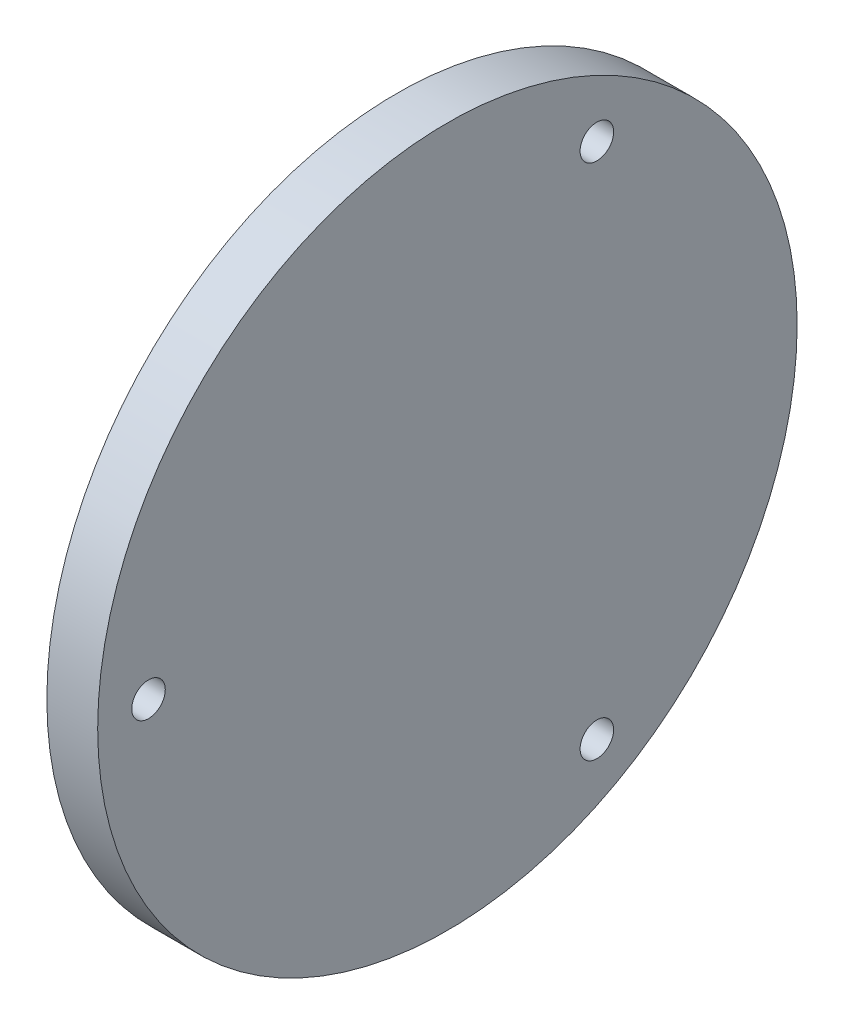
ISO-10303-21;
HEADER;
FILE_DESCRIPTION(('STEP AP214'),'2;1');
FILE_NAME('part.step','',(''),(''),'','','');
FILE_SCHEMA(('AUTOMOTIVE_DESIGN { 1 0 10303 214 1 1 1 1 }'));
ENDSEC;
DATA;
#1=APPLICATION_CONTEXT('core data for automotive mechanical design processes');
#2=APPLICATION_PROTOCOL_DEFINITION('international standard','automotive_design',2000,#1);
#3=PRODUCT_CONTEXT('',#1,'mechanical');
#4=PRODUCT('Part','Part','',(#3));
#5=PRODUCT_RELATED_PRODUCT_CATEGORY('part','',(#4));
#6=PRODUCT_DEFINITION_FORMATION('','',#4);
#7=PRODUCT_DEFINITION_CONTEXT('part definition',#1,'design');
#8=PRODUCT_DEFINITION('design','',#6,#7);
#9=PRODUCT_DEFINITION_SHAPE('','',#8);
#10=(LENGTH_UNIT() NAMED_UNIT(*) SI_UNIT(.MILLI.,.METRE.));
#11=(NAMED_UNIT(*) PLANE_ANGLE_UNIT() SI_UNIT($,.RADIAN.));
#12=(NAMED_UNIT(*) SI_UNIT($,.STERADIAN.) SOLID_ANGLE_UNIT());
#13=UNCERTAINTY_MEASURE_WITH_UNIT(LENGTH_MEASURE(1.E-05),#10,'distance_accuracy_value','');
#14=(GEOMETRIC_REPRESENTATION_CONTEXT(3) GLOBAL_UNCERTAINTY_ASSIGNED_CONTEXT((#13)) GLOBAL_UNIT_ASSIGNED_CONTEXT((#10,
#11,#12)) REPRESENTATION_CONTEXT('',''));
#15=CARTESIAN_POINT('',(0.,0.,0.));
#16=DIRECTION('',(0.,0.,1.));
#17=DIRECTION('',(1.,0.,0.));
#18=AXIS2_PLACEMENT_3D('',#15,#16,#17);
#19=CARTESIAN_POINT('',(163.7,34.4,0.));
#20=DIRECTION('',(1.,0.,0.));
#21=DIRECTION('',(0.,0.,-1.));
#22=AXIS2_PLACEMENT_3D('',#19,#20,#21);
#23=PLANE('',#22);
#24=CARTESIAN_POINT('',(163.7,0.,-29.4));
#25=DIRECTION('',(1.,0.,0.));
#26=DIRECTION('',(0.,0.,-1.));
#27=AXIS2_PLACEMENT_3D('',#24,#25,#26);
#28=CIRCLE('',#27,1.65);
#29=CARTESIAN_POINT('',(163.7,0.,-31.05));
#30=VERTEX_POINT('',#29);
#31=EDGE_CURVE('E34',#30,#30,#28,.T.);
#32=ORIENTED_EDGE('',*,*,#31,.T.);
#33=EDGE_LOOP('',(#32));
#34=FACE_BOUND('',#33,.T.);
#35=CARTESIAN_POINT('',(163.7,25.4611468712625,14.7));
#36=DIRECTION('',(1.,0.,0.));
#37=DIRECTION('',(0.,0.,-1.));
#38=AXIS2_PLACEMENT_3D('',#35,#36,#37);
#39=CIRCLE('',#38,1.65);
#40=CARTESIAN_POINT('',(163.7,25.4611468712625,13.05));
#41=VERTEX_POINT('',#40);
#42=EDGE_CURVE('E49',#41,#41,#39,.T.);
#43=ORIENTED_EDGE('',*,*,#42,.T.);
#44=EDGE_LOOP('',(#43));
#45=FACE_BOUND('',#44,.T.);
#46=CARTESIAN_POINT('',(163.7,-25.4611468712625,14.7));
#47=DIRECTION('',(1.,0.,0.));
#48=DIRECTION('',(0.,0.,-1.));
#49=AXIS2_PLACEMENT_3D('',#46,#47,#48);
#50=CIRCLE('',#49,1.65);
#51=CARTESIAN_POINT('',(163.7,-25.4611468712625,13.05));
#52=VERTEX_POINT('',#51);
#53=EDGE_CURVE('E47',#52,#52,#50,.T.);
#54=ORIENTED_EDGE('',*,*,#53,.T.);
#55=EDGE_LOOP('',(#54));
#56=FACE_BOUND('',#55,.T.);
#57=CARTESIAN_POINT('',(163.7,0.,29.4));
#58=DIRECTION('',(1.,0.,0.));
#59=DIRECTION('',(0.,0.,-1.));
#60=AXIS2_PLACEMENT_3D('',#57,#58,#59);
#61=CIRCLE('',#60,1.65);
#62=CARTESIAN_POINT('',(163.7,0.,27.75));
#63=VERTEX_POINT('',#62);
#64=EDGE_CURVE('E43',#63,#63,#61,.F.);
#65=ORIENTED_EDGE('',*,*,#64,.F.);
#66=EDGE_LOOP('',(#65));
#67=FACE_BOUND('',#66,.T.);
#68=CARTESIAN_POINT('',(163.7,-25.4611468712625,-14.7));
#69=DIRECTION('',(1.,0.,0.));
#70=DIRECTION('',(0.,0.,-1.));
#71=AXIS2_PLACEMENT_3D('',#68,#69,#70);
#72=CIRCLE('',#71,1.65);
#73=CARTESIAN_POINT('',(163.7,-25.4611468712625,-16.35));
#74=VERTEX_POINT('',#73);
#75=EDGE_CURVE('E71',#74,#74,#72,.F.);
#76=ORIENTED_EDGE('',*,*,#75,.F.);
#77=EDGE_LOOP('',(#76));
#78=FACE_BOUND('',#77,.T.);
#79=CARTESIAN_POINT('',(163.7,25.4611468712625,-14.7));
#80=DIRECTION('',(1.,0.,0.));
#81=DIRECTION('',(0.,0.,-1.));
#82=AXIS2_PLACEMENT_3D('',#79,#80,#81);
#83=CIRCLE('',#82,1.65);
#84=CARTESIAN_POINT('',(163.7,25.4611468712625,-16.35));
#85=VERTEX_POINT('',#84);
#86=EDGE_CURVE('E68',#85,#85,#83,.F.);
#87=ORIENTED_EDGE('',*,*,#86,.F.);
#88=EDGE_LOOP('',(#87));
#89=FACE_BOUND('',#88,.T.);
#90=CARTESIAN_POINT('',(163.7,0.,0.));
#91=DIRECTION('',(-1.,0.,0.));
#92=DIRECTION('',(0.,0.,1.));
#93=AXIS2_PLACEMENT_3D('',#90,#91,#92);
#94=CIRCLE('',#93,34.4);
#95=CARTESIAN_POINT('',(163.7,0.,34.4));
#96=VERTEX_POINT('',#95);
#97=EDGE_CURVE('E38',#96,#96,#94,.T.);
#98=ORIENTED_EDGE('',*,*,#97,.T.);
#99=EDGE_LOOP('',(#98));
#100=FACE_BOUND('',#99,.T.);
#101=ADVANCED_FACE('F31',(#34,#45,#56,#67,#78,#89,#100),#23,.F.);
#102=CARTESIAN_POINT('',(168.7,0.,0.));
#103=DIRECTION('',(-1.,0.,0.));
#104=DIRECTION('',(0.,0.,1.));
#105=AXIS2_PLACEMENT_3D('',#102,#103,#104);
#106=PLANE('',#105);
#107=CARTESIAN_POINT('',(168.7,0.,29.4));
#108=DIRECTION('',(1.,0.,0.));
#109=DIRECTION('',(0.,0.,-1.));
#110=AXIS2_PLACEMENT_3D('',#107,#108,#109);
#111=CIRCLE('',#110,1.65);
#112=CARTESIAN_POINT('',(168.7,0.,27.75));
#113=VERTEX_POINT('',#112);
#114=EDGE_CURVE('E64',#113,#113,#111,.T.);
#115=ORIENTED_EDGE('',*,*,#114,.F.);
#116=EDGE_LOOP('',(#115));
#117=FACE_BOUND('',#116,.T.);
#118=CARTESIAN_POINT('',(168.7,-25.4611468712625,-14.7));
#119=DIRECTION('',(1.,0.,0.));
#120=DIRECTION('',(0.,0.,-1.));
#121=AXIS2_PLACEMENT_3D('',#118,#119,#120);
#122=CIRCLE('',#121,1.65);
#123=CARTESIAN_POINT('',(168.7,-25.4611468712625,-16.35));
#124=VERTEX_POINT('',#123);
#125=EDGE_CURVE('E59',#124,#124,#122,.T.);
#126=ORIENTED_EDGE('',*,*,#125,.F.);
#127=EDGE_LOOP('',(#126));
#128=FACE_BOUND('',#127,.T.);
#129=CARTESIAN_POINT('',(168.7,25.4611468712625,-14.7));
#130=DIRECTION('',(1.,0.,0.));
#131=DIRECTION('',(0.,0.,-1.));
#132=AXIS2_PLACEMENT_3D('',#129,#130,#131);
#133=CIRCLE('',#132,1.65);
#134=CARTESIAN_POINT('',(168.7,25.4611468712625,-16.35));
#135=VERTEX_POINT('',#134);
#136=EDGE_CURVE('E55',#135,#135,#133,.T.);
#137=ORIENTED_EDGE('',*,*,#136,.F.);
#138=EDGE_LOOP('',(#137));
#139=FACE_BOUND('',#138,.T.);
#140=CARTESIAN_POINT('',(168.7,0.,0.));
#141=DIRECTION('',(-1.,0.,0.));
#142=DIRECTION('',(0.,0.,1.));
#143=AXIS2_PLACEMENT_3D('',#140,#141,#142);
#144=CIRCLE('',#143,34.4);
#145=CARTESIAN_POINT('',(168.7,0.,34.4));
#146=VERTEX_POINT('',#145);
#147=EDGE_CURVE('E10',#146,#146,#144,.T.);
#148=ORIENTED_EDGE('',*,*,#147,.F.);
#149=EDGE_LOOP('',(#148));
#150=FACE_BOUND('',#149,.T.);
#151=ADVANCED_FACE('F80',(#117,#128,#139,#150),#106,.F.);
#152=CARTESIAN_POINT('',(-110.,0.,0.));
#153=DIRECTION('',(-1.,0.,0.));
#154=DIRECTION('',(0.,0.,1.));
#155=AXIS2_PLACEMENT_3D('',#152,#153,#154);
#156=CYLINDRICAL_SURFACE('',#155,34.4);
#157=ORIENTED_EDGE('',*,*,#97,.F.);
#158=EDGE_LOOP('',(#157));
#159=FACE_BOUND('',#158,.T.);
#160=ORIENTED_EDGE('',*,*,#147,.T.);
#161=EDGE_LOOP('',(#160));
#162=FACE_BOUND('',#161,.T.);
#163=ADVANCED_FACE('F87',(#159,#162),#156,.T.);
#164=CARTESIAN_POINT('',(163.7,25.4611468712625,-14.7));
#165=DIRECTION('',(-1.,0.,0.));
#166=DIRECTION('',(0.,0.,1.));
#167=AXIS2_PLACEMENT_3D('',#164,#165,#166);
#168=CYLINDRICAL_SURFACE('',#167,1.65);
#169=ORIENTED_EDGE('',*,*,#136,.T.);
#170=EDGE_LOOP('',(#169));
#171=FACE_BOUND('',#170,.T.);
#172=ORIENTED_EDGE('',*,*,#86,.T.);
#173=EDGE_LOOP('',(#172));
#174=FACE_BOUND('',#173,.T.);
#175=ADVANCED_FACE('F89',(#171,#174),#168,.F.);
#176=CARTESIAN_POINT('',(163.7,-25.4611468712625,-14.7));
#177=DIRECTION('',(-1.,0.,0.));
#178=DIRECTION('',(0.,0.,1.));
#179=AXIS2_PLACEMENT_3D('',#176,#177,#178);
#180=CYLINDRICAL_SURFACE('',#179,1.65);
#181=ORIENTED_EDGE('',*,*,#125,.T.);
#182=EDGE_LOOP('',(#181));
#183=FACE_BOUND('',#182,.T.);
#184=ORIENTED_EDGE('',*,*,#75,.T.);
#185=EDGE_LOOP('',(#184));
#186=FACE_BOUND('',#185,.T.);
#187=ADVANCED_FACE('F95',(#183,#186),#180,.F.);
#188=CARTESIAN_POINT('',(163.7,0.,29.4));
#189=DIRECTION('',(-1.,0.,0.));
#190=DIRECTION('',(0.,0.,1.));
#191=AXIS2_PLACEMENT_3D('',#188,#189,#190);
#192=CYLINDRICAL_SURFACE('',#191,1.65);
#193=ORIENTED_EDGE('',*,*,#114,.T.);
#194=EDGE_LOOP('',(#193));
#195=FACE_BOUND('',#194,.T.);
#196=ORIENTED_EDGE('',*,*,#64,.T.);
#197=EDGE_LOOP('',(#196));
#198=FACE_BOUND('',#197,.T.);
#199=ADVANCED_FACE('F76',(#195,#198),#192,.F.);
#200=CARTESIAN_POINT('',(161.7,-25.4611468712625,14.7));
#201=DIRECTION('',(1.,0.,0.));
#202=DIRECTION('',(0.,0.,-1.));
#203=AXIS2_PLACEMENT_3D('',#200,#201,#202);
#204=CYLINDRICAL_SURFACE('',#203,1.65);
#205=CARTESIAN_POINT('',(165.2,-25.4611468712625,14.7));
#206=DIRECTION('',(1.,0.,0.));
#207=DIRECTION('',(0.,0.,-1.));
#208=AXIS2_PLACEMENT_3D('',#205,#206,#207);
#209=CIRCLE('',#208,1.65);
#210=CARTESIAN_POINT('',(165.2,-25.4611468712625,13.05));
#211=VERTEX_POINT('',#210);
#212=EDGE_CURVE('E135',#211,#211,#209,.T.);
#213=ORIENTED_EDGE('',*,*,#212,.T.);
#214=EDGE_LOOP('',(#213));
#215=FACE_BOUND('',#214,.T.);
#216=ORIENTED_EDGE('',*,*,#53,.F.);
#217=EDGE_LOOP('',(#216));
#218=FACE_BOUND('',#217,.T.);
#219=ADVANCED_FACE('F104',(#215,#218),#204,.F.);
#220=CARTESIAN_POINT('',(165.2,-25.4611468712625,14.7));
#221=DIRECTION('',(1.,0.,0.));
#222=DIRECTION('',(0.,0.,-1.));
#223=AXIS2_PLACEMENT_3D('',#220,#221,#222);
#224=PLANE('',#223);
#225=ORIENTED_EDGE('',*,*,#212,.F.);
#226=EDGE_LOOP('',(#225));
#227=FACE_BOUND('',#226,.T.);
#228=ADVANCED_FACE('F108',(#227),#224,.F.);
#229=CARTESIAN_POINT('',(161.7,25.4611468712625,14.7));
#230=DIRECTION('',(1.,0.,0.));
#231=DIRECTION('',(0.,0.,-1.));
#232=AXIS2_PLACEMENT_3D('',#229,#230,#231);
#233=CYLINDRICAL_SURFACE('',#232,1.65);
#234=CARTESIAN_POINT('',(165.2,25.4611468712625,14.7));
#235=DIRECTION('',(1.,0.,0.));
#236=DIRECTION('',(0.,0.,-1.));
#237=AXIS2_PLACEMENT_3D('',#234,#235,#236);
#238=CIRCLE('',#237,1.65);
#239=CARTESIAN_POINT('',(165.2,25.4611468712625,13.05));
#240=VERTEX_POINT('',#239);
#241=EDGE_CURVE('E132',#240,#240,#238,.T.);
#242=ORIENTED_EDGE('',*,*,#241,.T.);
#243=EDGE_LOOP('',(#242));
#244=FACE_BOUND('',#243,.T.);
#245=ORIENTED_EDGE('',*,*,#42,.F.);
#246=EDGE_LOOP('',(#245));
#247=FACE_BOUND('',#246,.T.);
#248=ADVANCED_FACE('F112',(#244,#247),#233,.F.);
#249=CARTESIAN_POINT('',(165.2,25.4611468712625,14.7));
#250=DIRECTION('',(1.,0.,0.));
#251=DIRECTION('',(0.,0.,-1.));
#252=AXIS2_PLACEMENT_3D('',#249,#250,#251);
#253=PLANE('',#252);
#254=ORIENTED_EDGE('',*,*,#241,.F.);
#255=EDGE_LOOP('',(#254));
#256=FACE_BOUND('',#255,.T.);
#257=ADVANCED_FACE('F116',(#256),#253,.F.);
#258=CARTESIAN_POINT('',(161.7,0.,-29.4));
#259=DIRECTION('',(1.,0.,0.));
#260=DIRECTION('',(0.,0.,-1.));
#261=AXIS2_PLACEMENT_3D('',#258,#259,#260);
#262=CYLINDRICAL_SURFACE('',#261,1.65);
#263=CARTESIAN_POINT('',(165.2,0.,-29.4));
#264=DIRECTION('',(1.,0.,0.));
#265=DIRECTION('',(0.,0.,-1.));
#266=AXIS2_PLACEMENT_3D('',#263,#264,#265);
#267=CIRCLE('',#266,1.65);
#268=CARTESIAN_POINT('',(165.2,0.,-31.05));
#269=VERTEX_POINT('',#268);
#270=EDGE_CURVE('E50',#269,#269,#267,.T.);
#271=ORIENTED_EDGE('',*,*,#270,.T.);
#272=EDGE_LOOP('',(#271));
#273=FACE_BOUND('',#272,.T.);
#274=ORIENTED_EDGE('',*,*,#31,.F.);
#275=EDGE_LOOP('',(#274));
#276=FACE_BOUND('',#275,.T.);
#277=ADVANCED_FACE('F120',(#273,#276),#262,.F.);
#278=CARTESIAN_POINT('',(165.2,0.,-29.4));
#279=DIRECTION('',(1.,0.,0.));
#280=DIRECTION('',(0.,0.,-1.));
#281=AXIS2_PLACEMENT_3D('',#278,#279,#280);
#282=PLANE('',#281);
#283=ORIENTED_EDGE('',*,*,#270,.F.);
#284=EDGE_LOOP('',(#283));
#285=FACE_BOUND('',#284,.T.);
#286=ADVANCED_FACE('F124',(#285),#282,.F.);
#287=CLOSED_SHELL('',(#101,#151,#163,#175,#187,#199,#219,#228,#248,#257,#277,#286));
#288=MANIFOLD_SOLID_BREP('B2',#287);
#289=ADVANCED_BREP_SHAPE_REPRESENTATION('',(#18,#288),#14);
#290=SHAPE_DEFINITION_REPRESENTATION(#9,#289);
ENDSEC;
END-ISO-10303-21;
